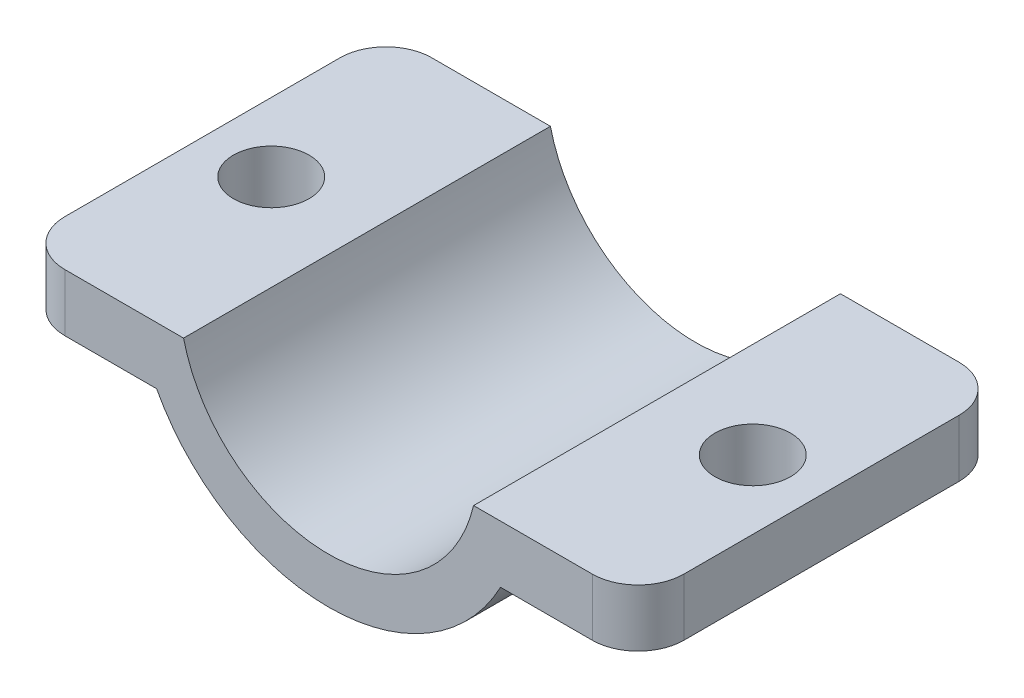
ISO-10303-21;
HEADER;
FILE_DESCRIPTION(('STEP AP214'),'2;1');
FILE_NAME('part.step','',(''),(''),'','','');
FILE_SCHEMA(('AUTOMOTIVE_DESIGN { 1 0 10303 214 1 1 1 1 }'));
ENDSEC;
DATA;
#1=APPLICATION_CONTEXT('core data for automotive mechanical design processes');
#2=APPLICATION_PROTOCOL_DEFINITION('international standard','automotive_design',2000,#1);
#3=PRODUCT_CONTEXT('',#1,'mechanical');
#4=PRODUCT('Part','Part','',(#3));
#5=PRODUCT_RELATED_PRODUCT_CATEGORY('part','',(#4));
#6=PRODUCT_DEFINITION_FORMATION('','',#4);
#7=PRODUCT_DEFINITION_CONTEXT('part definition',#1,'design');
#8=PRODUCT_DEFINITION('design','',#6,#7);
#9=PRODUCT_DEFINITION_SHAPE('','',#8);
#10=(LENGTH_UNIT() NAMED_UNIT(*) SI_UNIT(.MILLI.,.METRE.));
#11=(NAMED_UNIT(*) PLANE_ANGLE_UNIT() SI_UNIT($,.RADIAN.));
#12=(NAMED_UNIT(*) SI_UNIT($,.STERADIAN.) SOLID_ANGLE_UNIT());
#13=UNCERTAINTY_MEASURE_WITH_UNIT(LENGTH_MEASURE(1.E-05),#10,'distance_accuracy_value','');
#14=(GEOMETRIC_REPRESENTATION_CONTEXT(3) GLOBAL_UNCERTAINTY_ASSIGNED_CONTEXT((#13)) GLOBAL_UNIT_ASSIGNED_CONTEXT((#10,
#11,#12)) REPRESENTATION_CONTEXT('',''));
#15=CARTESIAN_POINT('',(0.,0.,0.));
#16=DIRECTION('',(0.,0.,1.));
#17=DIRECTION('',(1.,0.,0.));
#18=AXIS2_PLACEMENT_3D('',#15,#16,#17);
#19=CARTESIAN_POINT('',(0.,0.,16.));
#20=DIRECTION('',(0.,0.,-1.));
#21=DIRECTION('',(-1.,0.,0.));
#22=AXIS2_PLACEMENT_3D('',#19,#20,#21);
#23=CYLINDRICAL_SURFACE('',#22,6.5);
#24=CARTESIAN_POINT('',(0.,0.,0.));
#25=DIRECTION('',(0.,0.,-1.));
#26=DIRECTION('',(1.,0.,0.));
#27=AXIS2_PLACEMENT_3D('',#24,#25,#26);
#28=CIRCLE('',#27,6.5);
#29=CARTESIAN_POINT('',(6.32455532033676,-1.5,0.));
#30=VERTEX_POINT('',#29);
#31=CARTESIAN_POINT('',(-6.32455532033676,-1.5,0.));
#32=VERTEX_POINT('',#31);
#33=EDGE_CURVE('E148',#30,#32,#28,.T.);
#34=ORIENTED_EDGE('',*,*,#33,.T.);
#35=DIRECTION('',(0.,0.,-1.));
#36=VECTOR('',#35,1.);
#37=CARTESIAN_POINT('',(-6.32455532033676,-1.5,16.));
#38=LINE('',#37,#36);
#39=CARTESIAN_POINT('',(-6.32455532033676,-1.5,16.));
#40=VERTEX_POINT('',#39);
#41=EDGE_CURVE('E126',#40,#32,#38,.T.);
#42=ORIENTED_EDGE('',*,*,#41,.F.);
#43=CARTESIAN_POINT('',(0.,0.,16.));
#44=DIRECTION('',(0.,0.,-1.));
#45=DIRECTION('',(1.,0.,0.));
#46=AXIS2_PLACEMENT_3D('',#43,#44,#45);
#47=CIRCLE('',#46,6.5);
#48=CARTESIAN_POINT('',(6.32455532033676,-1.5,16.));
#49=VERTEX_POINT('',#48);
#50=EDGE_CURVE('E134',#49,#40,#47,.T.);
#51=ORIENTED_EDGE('',*,*,#50,.F.);
#52=DIRECTION('',(0.,0.,-1.));
#53=VECTOR('',#52,1.);
#54=CARTESIAN_POINT('',(6.32455532033676,-1.5,16.));
#55=LINE('',#54,#53);
#56=EDGE_CURVE('E204',#49,#30,#55,.T.);
#57=ORIENTED_EDGE('',*,*,#56,.T.);
#58=EDGE_LOOP('',(#34,#42,#51,#57));
#59=FACE_BOUND('',#58,.T.);
#60=ADVANCED_FACE('F34',(#59),#23,.F.);
#61=CARTESIAN_POINT('',(-6.32455532033676,-1.5,16.));
#62=DIRECTION('',(0.,-1.,0.));
#63=DIRECTION('',(1.,0.,0.));
#64=AXIS2_PLACEMENT_3D('',#61,#62,#63);
#65=PLANE('',#64);
#66=CARTESIAN_POINT('',(-10.5,-1.5,8.));
#67=DIRECTION('',(0.,-1.,0.));
#68=DIRECTION('',(0.,0.,-1.));
#69=AXIS2_PLACEMENT_3D('',#66,#67,#68);
#70=CIRCLE('',#69,1.65);
#71=CARTESIAN_POINT('',(-10.5,-1.5,6.35));
#72=VERTEX_POINT('',#71);
#73=EDGE_CURVE('E207',#72,#72,#70,.T.);
#74=ORIENTED_EDGE('',*,*,#73,.T.);
#75=EDGE_LOOP('',(#74));
#76=FACE_BOUND('',#75,.T.);
#77=DIRECTION('',(0.,0.,-1.));
#78=VECTOR('',#77,1.);
#79=CARTESIAN_POINT('',(-13.5,-1.5,16.));
#80=LINE('',#79,#78);
#81=CARTESIAN_POINT('',(-13.5,-1.5,14.));
#82=VERTEX_POINT('',#81);
#83=CARTESIAN_POINT('',(-13.5,-1.5,2.));
#84=VERTEX_POINT('',#83);
#85=EDGE_CURVE('E150',#82,#84,#80,.T.);
#86=ORIENTED_EDGE('',*,*,#85,.F.);
#87=CARTESIAN_POINT('',(-11.5,-1.5,14.));
#88=DIRECTION('',(0.,-1.,0.));
#89=DIRECTION('',(1.,0.,0.));
#90=AXIS2_PLACEMENT_3D('',#87,#88,#89);
#91=CIRCLE('',#90,2.);
#92=CARTESIAN_POINT('',(-11.5,-1.5,16.));
#93=VERTEX_POINT('',#92);
#94=EDGE_CURVE('E129',#82,#93,#91,.F.);
#95=ORIENTED_EDGE('',*,*,#94,.T.);
#96=DIRECTION('',(-1.,0.,0.));
#97=VECTOR('',#96,1.);
#98=CARTESIAN_POINT('',(-6.32455532033676,-1.5,16.));
#99=LINE('',#98,#97);
#100=EDGE_CURVE('E122',#40,#93,#99,.T.);
#101=ORIENTED_EDGE('',*,*,#100,.F.);
#102=ORIENTED_EDGE('',*,*,#41,.T.);
#103=DIRECTION('',(-1.,0.,0.));
#104=VECTOR('',#103,1.);
#105=CARTESIAN_POINT('',(-6.32455532033676,-1.5,0.));
#106=LINE('',#105,#104);
#107=CARTESIAN_POINT('',(-11.5,-1.5,0.));
#108=VERTEX_POINT('',#107);
#109=EDGE_CURVE('E206',#32,#108,#106,.T.);
#110=ORIENTED_EDGE('',*,*,#109,.T.);
#111=CARTESIAN_POINT('',(-11.5,-1.5,2.));
#112=DIRECTION('',(0.,-1.,0.));
#113=DIRECTION('',(1.,0.,0.));
#114=AXIS2_PLACEMENT_3D('',#111,#112,#113);
#115=CIRCLE('',#114,2.);
#116=EDGE_CURVE('E55',#108,#84,#115,.F.);
#117=ORIENTED_EDGE('',*,*,#116,.T.);
#118=EDGE_LOOP('',(#86,#95,#101,#102,#110,#117));
#119=FACE_BOUND('',#118,.T.);
#120=ADVANCED_FACE('F124',(#76,#119),#65,.F.);
#121=CARTESIAN_POINT('',(-13.5,-1.5,16.));
#122=DIRECTION('',(1.,0.,0.));
#123=DIRECTION('',(0.,1.,0.));
#124=AXIS2_PLACEMENT_3D('',#121,#122,#123);
#125=PLANE('',#124);
#126=DIRECTION('',(0.,0.,-1.));
#127=VECTOR('',#126,1.);
#128=CARTESIAN_POINT('',(-13.5,-4.,16.));
#129=LINE('',#128,#127);
#130=CARTESIAN_POINT('',(-13.5,-4.,14.));
#131=VERTEX_POINT('',#130);
#132=CARTESIAN_POINT('',(-13.5,-4.,2.));
#133=VERTEX_POINT('',#132);
#134=EDGE_CURVE('E154',#131,#133,#129,.T.);
#135=ORIENTED_EDGE('',*,*,#134,.F.);
#136=DIRECTION('',(0.,-1.,0.));
#137=VECTOR('',#136,1.);
#138=CARTESIAN_POINT('',(-13.5,-1.5,14.));
#139=LINE('',#138,#137);
#140=EDGE_CURVE('E179',#131,#82,#139,.F.);
#141=ORIENTED_EDGE('',*,*,#140,.T.);
#142=ORIENTED_EDGE('',*,*,#85,.T.);
#143=DIRECTION('',(0.,-1.,0.));
#144=VECTOR('',#143,1.);
#145=CARTESIAN_POINT('',(-13.5,-1.5,2.));
#146=LINE('',#145,#144);
#147=EDGE_CURVE('E176',#84,#133,#146,.T.);
#148=ORIENTED_EDGE('',*,*,#147,.T.);
#149=EDGE_LOOP('',(#135,#141,#142,#148));
#150=FACE_BOUND('',#149,.T.);
#151=ADVANCED_FACE('F185',(#150),#125,.F.);
#152=CARTESIAN_POINT('',(-13.5,-4.,16.));
#153=DIRECTION('',(0.,1.,0.));
#154=DIRECTION('',(0.,0.,1.));
#155=AXIS2_PLACEMENT_3D('',#152,#153,#154);
#156=PLANE('',#155);
#157=CARTESIAN_POINT('',(-10.5,-4.,8.));
#158=DIRECTION('',(0.,-1.,0.));
#159=DIRECTION('',(0.,0.,-1.));
#160=AXIS2_PLACEMENT_3D('',#157,#158,#159);
#161=CIRCLE('',#160,1.65);
#162=CARTESIAN_POINT('',(-10.5,-4.,6.35));
#163=VERTEX_POINT('',#162);
#164=EDGE_CURVE('E378',#163,#163,#161,.T.);
#165=ORIENTED_EDGE('',*,*,#164,.F.);
#166=EDGE_LOOP('',(#165));
#167=FACE_BOUND('',#166,.T.);
#168=DIRECTION('',(1.,0.,0.));
#169=VECTOR('',#168,1.);
#170=CARTESIAN_POINT('',(-13.5,-4.,16.));
#171=LINE('',#170,#169);
#172=CARTESIAN_POINT('',(-11.5,-4.,16.));
#173=VERTEX_POINT('',#172);
#174=CARTESIAN_POINT('',(-7.5,-4.,16.));
#175=VERTEX_POINT('',#174);
#176=EDGE_CURVE('E133',#173,#175,#171,.T.);
#177=ORIENTED_EDGE('',*,*,#176,.F.);
#178=CARTESIAN_POINT('',(-11.5,-4.,14.));
#179=DIRECTION('',(0.,1.,0.));
#180=DIRECTION('',(0.,0.,1.));
#181=AXIS2_PLACEMENT_3D('',#178,#179,#180);
#182=CIRCLE('',#181,2.);
#183=EDGE_CURVE('E174',#173,#131,#182,.F.);
#184=ORIENTED_EDGE('',*,*,#183,.T.);
#185=ORIENTED_EDGE('',*,*,#134,.T.);
#186=CARTESIAN_POINT('',(-11.5,-4.,2.));
#187=DIRECTION('',(0.,1.,0.));
#188=DIRECTION('',(0.,0.,1.));
#189=AXIS2_PLACEMENT_3D('',#186,#187,#188);
#190=CIRCLE('',#189,2.);
#191=CARTESIAN_POINT('',(-11.5,-4.,0.));
#192=VERTEX_POINT('',#191);
#193=EDGE_CURVE('E172',#133,#192,#190,.F.);
#194=ORIENTED_EDGE('',*,*,#193,.T.);
#195=DIRECTION('',(1.,0.,0.));
#196=VECTOR('',#195,1.);
#197=CARTESIAN_POINT('',(-13.5,-4.,0.));
#198=LINE('',#197,#196);
#199=CARTESIAN_POINT('',(-7.5,-4.,0.));
#200=VERTEX_POINT('',#199);
#201=EDGE_CURVE('E209',#192,#200,#198,.T.);
#202=ORIENTED_EDGE('',*,*,#201,.T.);
#203=DIRECTION('',(0.,0.,-1.));
#204=VECTOR('',#203,1.);
#205=CARTESIAN_POINT('',(-7.5,-4.,16.));
#206=LINE('',#205,#204);
#207=EDGE_CURVE('E195',#175,#200,#206,.T.);
#208=ORIENTED_EDGE('',*,*,#207,.F.);
#209=EDGE_LOOP('',(#177,#184,#185,#194,#202,#208));
#210=FACE_BOUND('',#209,.T.);
#211=ADVANCED_FACE('F193',(#167,#210),#156,.F.);
#212=CARTESIAN_POINT('',(0.,0.,16.));
#213=DIRECTION('',(0.,0.,-1.));
#214=DIRECTION('',(-1.,0.,0.));
#215=AXIS2_PLACEMENT_3D('',#212,#213,#214);
#216=CYLINDRICAL_SURFACE('',#215,8.5);
#217=CARTESIAN_POINT('',(0.,0.,0.));
#218=DIRECTION('',(0.,0.,1.));
#219=DIRECTION('',(1.,0.,0.));
#220=AXIS2_PLACEMENT_3D('',#217,#218,#219);
#221=CIRCLE('',#220,8.5);
#222=CARTESIAN_POINT('',(7.5,-4.,0.));
#223=VERTEX_POINT('',#222);
#224=EDGE_CURVE('E211',#200,#223,#221,.T.);
#225=ORIENTED_EDGE('',*,*,#224,.T.);
#226=DIRECTION('',(0.,0.,-1.));
#227=VECTOR('',#226,1.);
#228=CARTESIAN_POINT('',(7.5,-4.,16.));
#229=LINE('',#228,#227);
#230=CARTESIAN_POINT('',(7.5,-4.,16.));
#231=VERTEX_POINT('',#230);
#232=EDGE_CURVE('E224',#231,#223,#229,.T.);
#233=ORIENTED_EDGE('',*,*,#232,.F.);
#234=CARTESIAN_POINT('',(0.,0.,16.));
#235=DIRECTION('',(0.,0.,1.));
#236=DIRECTION('',(1.,0.,0.));
#237=AXIS2_PLACEMENT_3D('',#234,#235,#236);
#238=CIRCLE('',#237,8.5);
#239=EDGE_CURVE('E197',#175,#231,#238,.T.);
#240=ORIENTED_EDGE('',*,*,#239,.F.);
#241=ORIENTED_EDGE('',*,*,#207,.T.);
#242=EDGE_LOOP('',(#225,#233,#240,#241));
#243=FACE_BOUND('',#242,.T.);
#244=ADVANCED_FACE('F333',(#243),#216,.T.);
#245=CARTESIAN_POINT('',(13.5,-4.,16.));
#246=DIRECTION('',(0.,1.,0.));
#247=DIRECTION('',(0.,0.,1.));
#248=AXIS2_PLACEMENT_3D('',#245,#246,#247);
#249=PLANE('',#248);
#250=CARTESIAN_POINT('',(10.5,-4.,8.));
#251=DIRECTION('',(0.,-1.,0.));
#252=DIRECTION('',(0.,0.,-1.));
#253=AXIS2_PLACEMENT_3D('',#250,#251,#252);
#254=CIRCLE('',#253,1.65);
#255=CARTESIAN_POINT('',(10.5,-4.,6.35));
#256=VERTEX_POINT('',#255);
#257=EDGE_CURVE('E385',#256,#256,#254,.T.);
#258=ORIENTED_EDGE('',*,*,#257,.F.);
#259=EDGE_LOOP('',(#258));
#260=FACE_BOUND('',#259,.T.);
#261=DIRECTION('',(0.,0.,-1.));
#262=VECTOR('',#261,1.);
#263=CARTESIAN_POINT('',(13.5,-4.,16.));
#264=LINE('',#263,#262);
#265=CARTESIAN_POINT('',(13.5,-4.,14.));
#266=VERTEX_POINT('',#265);
#267=CARTESIAN_POINT('',(13.5,-4.,2.));
#268=VERTEX_POINT('',#267);
#269=EDGE_CURVE('E221',#266,#268,#264,.T.);
#270=ORIENTED_EDGE('',*,*,#269,.F.);
#271=CARTESIAN_POINT('',(11.5,-4.,14.));
#272=DIRECTION('',(0.,1.,0.));
#273=DIRECTION('',(0.,0.,1.));
#274=AXIS2_PLACEMENT_3D('',#271,#272,#273);
#275=CIRCLE('',#274,2.);
#276=CARTESIAN_POINT('',(11.5,-4.,16.));
#277=VERTEX_POINT('',#276);
#278=EDGE_CURVE('E170',#266,#277,#275,.F.);
#279=ORIENTED_EDGE('',*,*,#278,.T.);
#280=DIRECTION('',(1.,0.,0.));
#281=VECTOR('',#280,1.);
#282=CARTESIAN_POINT('',(13.5,-4.,16.));
#283=LINE('',#282,#281);
#284=EDGE_CURVE('E199',#231,#277,#283,.T.);
#285=ORIENTED_EDGE('',*,*,#284,.F.);
#286=ORIENTED_EDGE('',*,*,#232,.T.);
#287=DIRECTION('',(1.,0.,0.));
#288=VECTOR('',#287,1.);
#289=CARTESIAN_POINT('',(13.5,-4.,0.));
#290=LINE('',#289,#288);
#291=CARTESIAN_POINT('',(11.5,-4.,0.));
#292=VERTEX_POINT('',#291);
#293=EDGE_CURVE('E213',#223,#292,#290,.T.);
#294=ORIENTED_EDGE('',*,*,#293,.T.);
#295=CARTESIAN_POINT('',(11.5,-4.,2.));
#296=DIRECTION('',(0.,1.,0.));
#297=DIRECTION('',(0.,0.,1.));
#298=AXIS2_PLACEMENT_3D('',#295,#296,#297);
#299=CIRCLE('',#298,2.);
#300=EDGE_CURVE('E168',#292,#268,#299,.F.);
#301=ORIENTED_EDGE('',*,*,#300,.T.);
#302=EDGE_LOOP('',(#270,#279,#285,#286,#294,#301));
#303=FACE_BOUND('',#302,.T.);
#304=ADVANCED_FACE('F324',(#260,#303),#249,.F.);
#305=CARTESIAN_POINT('',(13.5,-1.5,16.));
#306=DIRECTION('',(-1.,0.,0.));
#307=DIRECTION('',(0.,-1.,0.));
#308=AXIS2_PLACEMENT_3D('',#305,#306,#307);
#309=PLANE('',#308);
#310=DIRECTION('',(0.,0.,-1.));
#311=VECTOR('',#310,1.);
#312=CARTESIAN_POINT('',(13.5,-1.5,16.));
#313=LINE('',#312,#311);
#314=CARTESIAN_POINT('',(13.5,-1.5,14.));
#315=VERTEX_POINT('',#314);
#316=CARTESIAN_POINT('',(13.5,-1.5,2.));
#317=VERTEX_POINT('',#316);
#318=EDGE_CURVE('E218',#315,#317,#313,.T.);
#319=ORIENTED_EDGE('',*,*,#318,.F.);
#320=DIRECTION('',(0.,1.,0.));
#321=VECTOR('',#320,1.);
#322=CARTESIAN_POINT('',(13.5,-4.,14.));
#323=LINE('',#322,#321);
#324=EDGE_CURVE('E166',#315,#266,#323,.F.);
#325=ORIENTED_EDGE('',*,*,#324,.T.);
#326=ORIENTED_EDGE('',*,*,#269,.T.);
#327=DIRECTION('',(0.,1.,0.));
#328=VECTOR('',#327,1.);
#329=CARTESIAN_POINT('',(13.5,-1.5,2.));
#330=LINE('',#329,#328);
#331=EDGE_CURVE('E163',#268,#317,#330,.T.);
#332=ORIENTED_EDGE('',*,*,#331,.T.);
#333=EDGE_LOOP('',(#319,#325,#326,#332));
#334=FACE_BOUND('',#333,.T.);
#335=ADVANCED_FACE('F315',(#334),#309,.F.);
#336=CARTESIAN_POINT('',(6.32455532033676,-1.5,16.));
#337=DIRECTION('',(0.,-1.,0.));
#338=DIRECTION('',(1.,0.,0.));
#339=AXIS2_PLACEMENT_3D('',#336,#337,#338);
#340=PLANE('',#339);
#341=CARTESIAN_POINT('',(10.5,-1.5,8.));
#342=DIRECTION('',(0.,-1.,0.));
#343=DIRECTION('',(0.,0.,-1.));
#344=AXIS2_PLACEMENT_3D('',#341,#342,#343);
#345=CIRCLE('',#344,1.65);
#346=CARTESIAN_POINT('',(10.5,-1.5,6.35));
#347=VERTEX_POINT('',#346);
#348=EDGE_CURVE('E380',#347,#347,#345,.T.);
#349=ORIENTED_EDGE('',*,*,#348,.T.);
#350=EDGE_LOOP('',(#349));
#351=FACE_BOUND('',#350,.T.);
#352=DIRECTION('',(-1.,0.,0.));
#353=VECTOR('',#352,1.);
#354=CARTESIAN_POINT('',(6.32455532033676,-1.5,16.));
#355=LINE('',#354,#353);
#356=CARTESIAN_POINT('',(11.5,-1.5,16.));
#357=VERTEX_POINT('',#356);
#358=EDGE_CURVE('E141',#357,#49,#355,.T.);
#359=ORIENTED_EDGE('',*,*,#358,.F.);
#360=CARTESIAN_POINT('',(11.5,-1.5,14.));
#361=DIRECTION('',(0.,-1.,0.));
#362=DIRECTION('',(1.,0.,0.));
#363=AXIS2_PLACEMENT_3D('',#360,#361,#362);
#364=CIRCLE('',#363,2.);
#365=EDGE_CURVE('E161',#357,#315,#364,.F.);
#366=ORIENTED_EDGE('',*,*,#365,.T.);
#367=ORIENTED_EDGE('',*,*,#318,.T.);
#368=CARTESIAN_POINT('',(11.5,-1.5,2.));
#369=DIRECTION('',(0.,-1.,0.));
#370=DIRECTION('',(1.,0.,0.));
#371=AXIS2_PLACEMENT_3D('',#368,#369,#370);
#372=CIRCLE('',#371,2.);
#373=CARTESIAN_POINT('',(11.5,-1.5,0.));
#374=VERTEX_POINT('',#373);
#375=EDGE_CURVE('E159',#317,#374,#372,.F.);
#376=ORIENTED_EDGE('',*,*,#375,.T.);
#377=DIRECTION('',(-1.,0.,0.));
#378=VECTOR('',#377,1.);
#379=CARTESIAN_POINT('',(6.32455532033676,-1.5,0.));
#380=LINE('',#379,#378);
#381=EDGE_CURVE('E145',#374,#30,#380,.T.);
#382=ORIENTED_EDGE('',*,*,#381,.T.);
#383=ORIENTED_EDGE('',*,*,#56,.F.);
#384=EDGE_LOOP('',(#359,#366,#367,#376,#382,#383));
#385=FACE_BOUND('',#384,.T.);
#386=ADVANCED_FACE('F307',(#351,#385),#340,.F.);
#387=CARTESIAN_POINT('',(0.,0.,16.));
#388=DIRECTION('',(0.,0.,1.));
#389=DIRECTION('',(1.,0.,0.));
#390=AXIS2_PLACEMENT_3D('',#387,#388,#389);
#391=PLANE('',#390);
#392=ORIENTED_EDGE('',*,*,#284,.T.);
#393=DIRECTION('',(0.,1.,0.));
#394=VECTOR('',#393,1.);
#395=CARTESIAN_POINT('',(11.5,-1.5,16.));
#396=LINE('',#395,#394);
#397=EDGE_CURVE('E152',#277,#357,#396,.T.);
#398=ORIENTED_EDGE('',*,*,#397,.T.);
#399=ORIENTED_EDGE('',*,*,#358,.T.);
#400=ORIENTED_EDGE('',*,*,#50,.T.);
#401=ORIENTED_EDGE('',*,*,#100,.T.);
#402=DIRECTION('',(0.,-1.,0.));
#403=VECTOR('',#402,1.);
#404=CARTESIAN_POINT('',(-11.5,-4.,16.));
#405=LINE('',#404,#403);
#406=EDGE_CURVE('E149',#93,#173,#405,.T.);
#407=ORIENTED_EDGE('',*,*,#406,.T.);
#408=ORIENTED_EDGE('',*,*,#176,.T.);
#409=ORIENTED_EDGE('',*,*,#239,.T.);
#410=EDGE_LOOP('',(#392,#398,#399,#400,#401,#407,#408,#409));
#411=FACE_BOUND('',#410,.T.);
#412=ADVANCED_FACE('F138',(#411),#391,.T.);
#413=CARTESIAN_POINT('',(0.,0.,0.));
#414=DIRECTION('',(0.,0.,1.));
#415=DIRECTION('',(1.,0.,0.));
#416=AXIS2_PLACEMENT_3D('',#413,#414,#415);
#417=PLANE('',#416);
#418=ORIENTED_EDGE('',*,*,#381,.F.);
#419=DIRECTION('',(0.,1.,0.));
#420=VECTOR('',#419,1.);
#421=CARTESIAN_POINT('',(11.5,0.,0.));
#422=LINE('',#421,#420);
#423=EDGE_CURVE('E11',#374,#292,#422,.F.);
#424=ORIENTED_EDGE('',*,*,#423,.T.);
#425=ORIENTED_EDGE('',*,*,#293,.F.);
#426=ORIENTED_EDGE('',*,*,#224,.F.);
#427=ORIENTED_EDGE('',*,*,#201,.F.);
#428=DIRECTION('',(0.,-1.,0.));
#429=VECTOR('',#428,1.);
#430=CARTESIAN_POINT('',(-11.5,0.,0.));
#431=LINE('',#430,#429);
#432=EDGE_CURVE('E42',#192,#108,#431,.F.);
#433=ORIENTED_EDGE('',*,*,#432,.T.);
#434=ORIENTED_EDGE('',*,*,#109,.F.);
#435=ORIENTED_EDGE('',*,*,#33,.F.);
#436=EDGE_LOOP('',(#418,#424,#425,#426,#427,#433,#434,#435));
#437=FACE_BOUND('',#436,.T.);
#438=ADVANCED_FACE('F230',(#437),#417,.F.);
#439=CARTESIAN_POINT('',(10.5,-1.5,8.));
#440=DIRECTION('',(0.,-1.,0.));
#441=DIRECTION('',(0.,0.,-1.));
#442=AXIS2_PLACEMENT_3D('',#439,#440,#441);
#443=CYLINDRICAL_SURFACE('',#442,1.65);
#444=CARTESIAN_POINT('',(10.5,-1.5,6.35));
#445=CARTESIAN_POINT('',(10.5,-1.52604166666667,6.35));
#446=CARTESIAN_POINT('',(10.5,-1.55208333333333,6.35));
#447=CARTESIAN_POINT('',(10.5,-1.60416666666667,6.35));
#448=CARTESIAN_POINT('',(10.5,-1.63020833333333,6.35));
#449=CARTESIAN_POINT('',(10.5,-1.68229166666667,6.35));
#450=CARTESIAN_POINT('',(10.5,-1.70833333333333,6.35));
#451=CARTESIAN_POINT('',(10.5,-1.76041666666667,6.35));
#452=CARTESIAN_POINT('',(10.5,-1.78645833333333,6.35));
#453=CARTESIAN_POINT('',(10.5,-1.83854166666667,6.35));
#454=CARTESIAN_POINT('',(10.5,-1.86458333333333,6.35));
#455=CARTESIAN_POINT('',(10.5,-1.91666666666667,6.35));
#456=CARTESIAN_POINT('',(10.5,-1.94270833333333,6.35));
#457=CARTESIAN_POINT('',(10.5,-1.99479166666667,6.35));
#458=CARTESIAN_POINT('',(10.5,-2.02083333333333,6.35));
#459=CARTESIAN_POINT('',(10.5,-2.07291666666667,6.35));
#460=CARTESIAN_POINT('',(10.5,-2.09895833333333,6.35));
#461=CARTESIAN_POINT('',(10.5,-2.15104166666667,6.35));
#462=CARTESIAN_POINT('',(10.5,-2.17708333333333,6.35));
#463=CARTESIAN_POINT('',(10.5,-2.22916666666667,6.35));
#464=CARTESIAN_POINT('',(10.5,-2.25520833333333,6.35));
#465=CARTESIAN_POINT('',(10.5,-2.30729166666667,6.35));
#466=CARTESIAN_POINT('',(10.5,-2.33333333333333,6.35));
#467=CARTESIAN_POINT('',(10.5,-2.38541666666667,6.35));
#468=CARTESIAN_POINT('',(10.5,-2.41145833333333,6.35));
#469=CARTESIAN_POINT('',(10.5,-2.46354166666667,6.35));
#470=CARTESIAN_POINT('',(10.5,-2.48958333333333,6.35));
#471=CARTESIAN_POINT('',(10.5,-2.54166666666667,6.35));
#472=CARTESIAN_POINT('',(10.5,-2.56770833333333,6.35));
#473=CARTESIAN_POINT('',(10.5,-2.61979166666667,6.35));
#474=CARTESIAN_POINT('',(10.5,-2.64583333333333,6.35));
#475=CARTESIAN_POINT('',(10.5,-2.69791666666667,6.35));
#476=CARTESIAN_POINT('',(10.5,-2.72395833333333,6.35));
#477=CARTESIAN_POINT('',(10.5,-2.77604166666667,6.35));
#478=CARTESIAN_POINT('',(10.5,-2.80208333333333,6.35));
#479=CARTESIAN_POINT('',(10.5,-2.85416666666667,6.35));
#480=CARTESIAN_POINT('',(10.5,-2.88020833333333,6.35));
#481=CARTESIAN_POINT('',(10.5,-2.93229166666667,6.35));
#482=CARTESIAN_POINT('',(10.5,-2.95833333333333,6.35));
#483=CARTESIAN_POINT('',(10.5,-3.01041666666667,6.35));
#484=CARTESIAN_POINT('',(10.5,-3.03645833333333,6.35));
#485=CARTESIAN_POINT('',(10.5,-3.08854166666667,6.35));
#486=CARTESIAN_POINT('',(10.5,-3.11458333333333,6.35));
#487=CARTESIAN_POINT('',(10.5,-3.16666666666667,6.35));
#488=CARTESIAN_POINT('',(10.5,-3.19270833333333,6.35));
#489=CARTESIAN_POINT('',(10.5,-3.24479166666667,6.35));
#490=CARTESIAN_POINT('',(10.5,-3.27083333333333,6.35));
#491=CARTESIAN_POINT('',(10.5,-3.32291666666667,6.35));
#492=CARTESIAN_POINT('',(10.5,-3.34895833333333,6.35));
#493=CARTESIAN_POINT('',(10.5,-3.40104166666667,6.35));
#494=CARTESIAN_POINT('',(10.5,-3.42708333333333,6.35));
#495=CARTESIAN_POINT('',(10.5,-3.47916666666667,6.35));
#496=CARTESIAN_POINT('',(10.5,-3.50520833333333,6.35));
#497=CARTESIAN_POINT('',(10.5,-3.55729166666667,6.35));
#498=CARTESIAN_POINT('',(10.5,-3.58333333333333,6.35));
#499=CARTESIAN_POINT('',(10.5,-3.63541666666667,6.35));
#500=CARTESIAN_POINT('',(10.5,-3.66145833333333,6.35));
#501=CARTESIAN_POINT('',(10.5,-3.71354166666667,6.35));
#502=CARTESIAN_POINT('',(10.5,-3.73958333333333,6.35));
#503=CARTESIAN_POINT('',(10.5,-3.79166666666667,6.35));
#504=CARTESIAN_POINT('',(10.5,-3.81770833333333,6.35));
#505=CARTESIAN_POINT('',(10.5,-3.86979166666667,6.35));
#506=CARTESIAN_POINT('',(10.5,-3.89583333333333,6.35));
#507=CARTESIAN_POINT('',(10.5,-3.94791666666667,6.35));
#508=CARTESIAN_POINT('',(10.5,-3.97395833333333,6.35));
#509=CARTESIAN_POINT('',(10.5,-4.,6.35));
#510=B_SPLINE_CURVE_WITH_KNOTS('',3,(#444,#445,#446,#447,#448,#449,#450,#451,#452,#453,#454,
#455,#456,#457,#458,#459,#460,#461,#462,#463,#464,#465,#466,#467,#468,#469,#470,#471,#472,#473,
#474,#475,#476,#477,#478,#479,#480,#481,#482,#483,#484,#485,#486,#487,#488,#489,#490,#491,#492,
#493,#494,#495,#496,#497,#498,#499,#500,#501,#502,#503,#504,#505,#506,#507,#508,#509),
.UNSPECIFIED.,.F.,.F.,(4,2,2,2,2,2,2,2,2,2,2,2,2,2,2,2,2,2,2,2,2,2,2,2,2,2,2,2,2,2,2,2,4),(0.,
0.0781249999999998,0.15625,0.234375,0.3125,0.390625,0.46875,0.546875,0.625,0.703125,0.78125,
0.859375,0.9375,1.015625,1.09375,1.171875,1.25,1.328125,1.40625,1.484375,1.5625,1.640625,
1.71875,1.796875,1.875,1.953125,2.03125,2.109375,2.1875,2.265625,2.34375,2.421875,2.5),.UNSPECIFIED.);
#511=EDGE_CURVE('BSEAM282',#347,#256,#510,.T.);
#512=ORIENTED_EDGE('',*,*,#348,.F.);
#513=ORIENTED_EDGE('',*,*,#257,.T.);
#514=ORIENTED_EDGE('',*,*,#511,.T.);
#515=ORIENTED_EDGE('',*,*,#511,.F.);
#516=EDGE_LOOP('',(#512,#514,#513,#515));
#517=FACE_BOUND('',#516,.T.);
#518=ADVANCED_FACE('F282',(#517),#443,.F.);
#519=CARTESIAN_POINT('',(-10.5,-1.5,8.));
#520=DIRECTION('',(0.,-1.,0.));
#521=DIRECTION('',(0.,0.,-1.));
#522=AXIS2_PLACEMENT_3D('',#519,#520,#521);
#523=CYLINDRICAL_SURFACE('',#522,1.65);
#524=CARTESIAN_POINT('',(-10.5,-1.5,6.35));
#525=CARTESIAN_POINT('',(-10.5,-1.52604166666667,6.35));
#526=CARTESIAN_POINT('',(-10.5,-1.55208333333333,6.35));
#527=CARTESIAN_POINT('',(-10.5,-1.60416666666667,6.35));
#528=CARTESIAN_POINT('',(-10.5,-1.63020833333333,6.35));
#529=CARTESIAN_POINT('',(-10.5,-1.68229166666667,6.35));
#530=CARTESIAN_POINT('',(-10.5,-1.70833333333333,6.35));
#531=CARTESIAN_POINT('',(-10.5,-1.76041666666667,6.35));
#532=CARTESIAN_POINT('',(-10.5,-1.78645833333333,6.35));
#533=CARTESIAN_POINT('',(-10.5,-1.83854166666667,6.35));
#534=CARTESIAN_POINT('',(-10.5,-1.86458333333333,6.35));
#535=CARTESIAN_POINT('',(-10.5,-1.91666666666667,6.35));
#536=CARTESIAN_POINT('',(-10.5,-1.94270833333333,6.35));
#537=CARTESIAN_POINT('',(-10.5,-1.99479166666667,6.35));
#538=CARTESIAN_POINT('',(-10.5,-2.02083333333333,6.35));
#539=CARTESIAN_POINT('',(-10.5,-2.07291666666667,6.35));
#540=CARTESIAN_POINT('',(-10.5,-2.09895833333333,6.35));
#541=CARTESIAN_POINT('',(-10.5,-2.15104166666667,6.35));
#542=CARTESIAN_POINT('',(-10.5,-2.17708333333333,6.35));
#543=CARTESIAN_POINT('',(-10.5,-2.22916666666667,6.35));
#544=CARTESIAN_POINT('',(-10.5,-2.25520833333333,6.35));
#545=CARTESIAN_POINT('',(-10.5,-2.30729166666667,6.35));
#546=CARTESIAN_POINT('',(-10.5,-2.33333333333333,6.35));
#547=CARTESIAN_POINT('',(-10.5,-2.38541666666667,6.35));
#548=CARTESIAN_POINT('',(-10.5,-2.41145833333333,6.35));
#549=CARTESIAN_POINT('',(-10.5,-2.46354166666667,6.35));
#550=CARTESIAN_POINT('',(-10.5,-2.48958333333333,6.35));
#551=CARTESIAN_POINT('',(-10.5,-2.54166666666667,6.35));
#552=CARTESIAN_POINT('',(-10.5,-2.56770833333333,6.35));
#553=CARTESIAN_POINT('',(-10.5,-2.61979166666667,6.35));
#554=CARTESIAN_POINT('',(-10.5,-2.64583333333333,6.35));
#555=CARTESIAN_POINT('',(-10.5,-2.69791666666667,6.35));
#556=CARTESIAN_POINT('',(-10.5,-2.72395833333333,6.35));
#557=CARTESIAN_POINT('',(-10.5,-2.77604166666667,6.35));
#558=CARTESIAN_POINT('',(-10.5,-2.80208333333333,6.35));
#559=CARTESIAN_POINT('',(-10.5,-2.85416666666667,6.35));
#560=CARTESIAN_POINT('',(-10.5,-2.88020833333333,6.35));
#561=CARTESIAN_POINT('',(-10.5,-2.93229166666667,6.35));
#562=CARTESIAN_POINT('',(-10.5,-2.95833333333333,6.35));
#563=CARTESIAN_POINT('',(-10.5,-3.01041666666667,6.35));
#564=CARTESIAN_POINT('',(-10.5,-3.03645833333333,6.35));
#565=CARTESIAN_POINT('',(-10.5,-3.08854166666667,6.35));
#566=CARTESIAN_POINT('',(-10.5,-3.11458333333333,6.35));
#567=CARTESIAN_POINT('',(-10.5,-3.16666666666667,6.35));
#568=CARTESIAN_POINT('',(-10.5,-3.19270833333333,6.35));
#569=CARTESIAN_POINT('',(-10.5,-3.24479166666667,6.35));
#570=CARTESIAN_POINT('',(-10.5,-3.27083333333333,6.35));
#571=CARTESIAN_POINT('',(-10.5,-3.32291666666667,6.35));
#572=CARTESIAN_POINT('',(-10.5,-3.34895833333333,6.35));
#573=CARTESIAN_POINT('',(-10.5,-3.40104166666667,6.35));
#574=CARTESIAN_POINT('',(-10.5,-3.42708333333333,6.35));
#575=CARTESIAN_POINT('',(-10.5,-3.47916666666667,6.35));
#576=CARTESIAN_POINT('',(-10.5,-3.50520833333333,6.35));
#577=CARTESIAN_POINT('',(-10.5,-3.55729166666667,6.35));
#578=CARTESIAN_POINT('',(-10.5,-3.58333333333333,6.35));
#579=CARTESIAN_POINT('',(-10.5,-3.63541666666667,6.35));
#580=CARTESIAN_POINT('',(-10.5,-3.66145833333333,6.35));
#581=CARTESIAN_POINT('',(-10.5,-3.71354166666667,6.35));
#582=CARTESIAN_POINT('',(-10.5,-3.73958333333333,6.35));
#583=CARTESIAN_POINT('',(-10.5,-3.79166666666667,6.35));
#584=CARTESIAN_POINT('',(-10.5,-3.81770833333333,6.35));
#585=CARTESIAN_POINT('',(-10.5,-3.86979166666667,6.35));
#586=CARTESIAN_POINT('',(-10.5,-3.89583333333333,6.35));
#587=CARTESIAN_POINT('',(-10.5,-3.94791666666667,6.35));
#588=CARTESIAN_POINT('',(-10.5,-3.97395833333333,6.35));
#589=CARTESIAN_POINT('',(-10.5,-4.,6.35));
#590=B_SPLINE_CURVE_WITH_KNOTS('',3,(#524,#525,#526,#527,#528,#529,#530,#531,#532,#533,#534,
#535,#536,#537,#538,#539,#540,#541,#542,#543,#544,#545,#546,#547,#548,#549,#550,#551,#552,#553,
#554,#555,#556,#557,#558,#559,#560,#561,#562,#563,#564,#565,#566,#567,#568,#569,#570,#571,#572,
#573,#574,#575,#576,#577,#578,#579,#580,#581,#582,#583,#584,#585,#586,#587,#588,#589),
.UNSPECIFIED.,.F.,.F.,(4,2,2,2,2,2,2,2,2,2,2,2,2,2,2,2,2,2,2,2,2,2,2,2,2,2,2,2,2,2,2,2,4),(0.,
0.0781249999999998,0.15625,0.234375,0.3125,0.390625,0.46875,0.546875,0.625,0.703125,0.78125,
0.859375,0.9375,1.015625,1.09375,1.171875,1.25,1.328125,1.40625,1.484375,1.5625,1.640625,
1.71875,1.796875,1.875,1.953125,2.03125,2.109375,2.1875,2.265625,2.34375,2.421875,2.5),.UNSPECIFIED.);
#591=EDGE_CURVE('BSEAM250',#72,#163,#590,.T.);
#592=ORIENTED_EDGE('',*,*,#73,.F.);
#593=ORIENTED_EDGE('',*,*,#164,.T.);
#594=ORIENTED_EDGE('',*,*,#591,.T.);
#595=ORIENTED_EDGE('',*,*,#591,.F.);
#596=EDGE_LOOP('',(#592,#594,#593,#595));
#597=FACE_BOUND('',#596,.T.);
#598=ADVANCED_FACE('F250',(#597),#523,.F.);
#599=CARTESIAN_POINT('',(11.5,0.,14.));
#600=DIRECTION('',(0.,-1.,0.));
#601=DIRECTION('',(1.,0.,0.));
#602=AXIS2_PLACEMENT_3D('',#599,#600,#601);
#603=CYLINDRICAL_SURFACE('',#602,2.);
#604=ORIENTED_EDGE('',*,*,#278,.F.);
#605=ORIENTED_EDGE('',*,*,#324,.F.);
#606=ORIENTED_EDGE('',*,*,#365,.F.);
#607=ORIENTED_EDGE('',*,*,#397,.F.);
#608=EDGE_LOOP('',(#604,#605,#606,#607));
#609=FACE_BOUND('',#608,.T.);
#610=ADVANCED_FACE('F247',(#609),#603,.T.);
#611=CARTESIAN_POINT('',(-11.5,0.,14.));
#612=DIRECTION('',(0.,1.,0.));
#613=DIRECTION('',(-1.,0.,0.));
#614=AXIS2_PLACEMENT_3D('',#611,#612,#613);
#615=CYLINDRICAL_SURFACE('',#614,2.);
#616=ORIENTED_EDGE('',*,*,#94,.F.);
#617=ORIENTED_EDGE('',*,*,#140,.F.);
#618=ORIENTED_EDGE('',*,*,#183,.F.);
#619=ORIENTED_EDGE('',*,*,#406,.F.);
#620=EDGE_LOOP('',(#616,#617,#618,#619));
#621=FACE_BOUND('',#620,.T.);
#622=ADVANCED_FACE('F189',(#621),#615,.T.);
#623=CARTESIAN_POINT('',(11.5,-1.5,2.));
#624=DIRECTION('',(0.,1.,0.));
#625=DIRECTION('',(-1.,0.,0.));
#626=AXIS2_PLACEMENT_3D('',#623,#624,#625);
#627=CYLINDRICAL_SURFACE('',#626,2.);
#628=ORIENTED_EDGE('',*,*,#300,.F.);
#629=ORIENTED_EDGE('',*,*,#423,.F.);
#630=ORIENTED_EDGE('',*,*,#375,.F.);
#631=ORIENTED_EDGE('',*,*,#331,.F.);
#632=EDGE_LOOP('',(#628,#629,#630,#631));
#633=FACE_BOUND('',#632,.T.);
#634=ADVANCED_FACE('F233',(#633),#627,.T.);
#635=CARTESIAN_POINT('',(-11.5,-1.5,2.));
#636=DIRECTION('',(0.,-1.,0.));
#637=DIRECTION('',(1.,0.,0.));
#638=AXIS2_PLACEMENT_3D('',#635,#636,#637);
#639=CYLINDRICAL_SURFACE('',#638,2.);
#640=ORIENTED_EDGE('',*,*,#116,.F.);
#641=ORIENTED_EDGE('',*,*,#432,.F.);
#642=ORIENTED_EDGE('',*,*,#193,.F.);
#643=ORIENTED_EDGE('',*,*,#147,.F.);
#644=EDGE_LOOP('',(#640,#641,#642,#643));
#645=FACE_BOUND('',#644,.T.);
#646=ADVANCED_FACE('F36',(#645),#639,.T.);
#647=CLOSED_SHELL('',(#60,#120,#151,#211,#244,#304,#335,#386,#412,#438,#518,#598,#610,#622,#634,#646));
#648=MANIFOLD_SOLID_BREP('B2',#647);
#649=ADVANCED_BREP_SHAPE_REPRESENTATION('',(#18,#648),#14);
#650=SHAPE_DEFINITION_REPRESENTATION(#9,#649);
ENDSEC;
END-ISO-10303-21;
